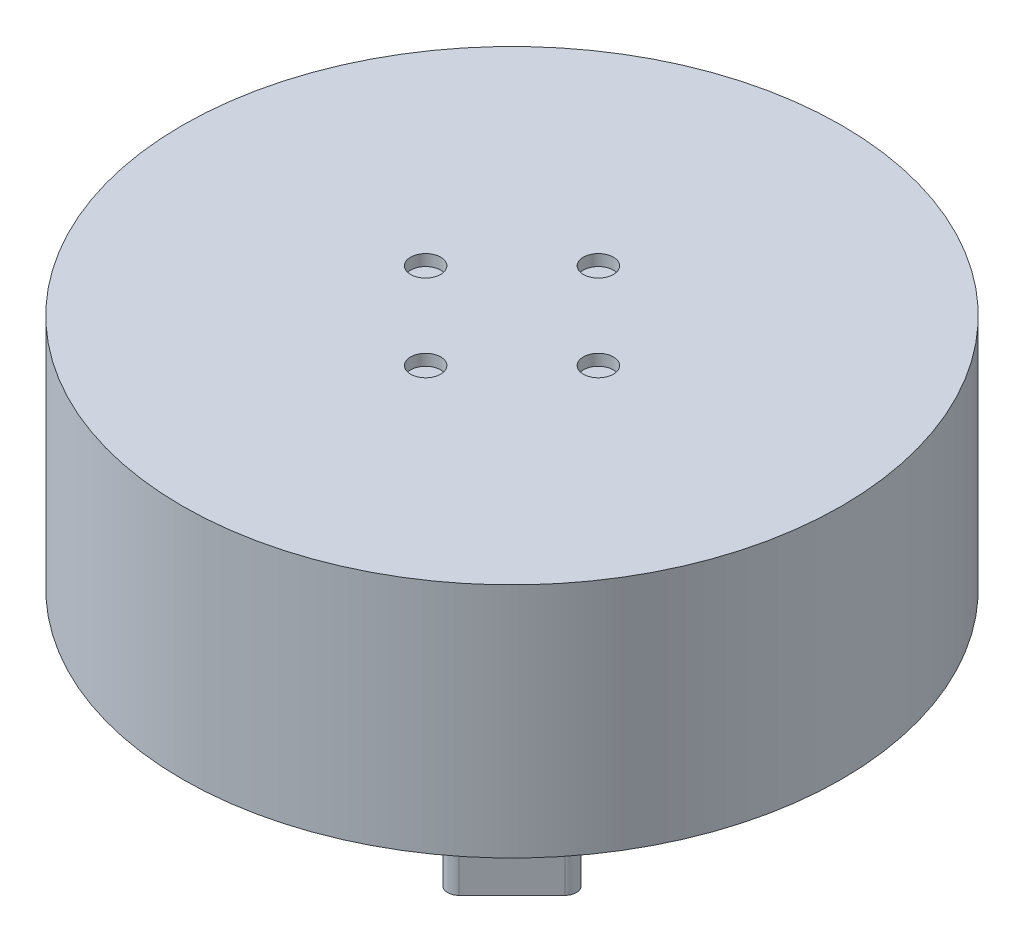
ISO-10303-21;
HEADER;
FILE_DESCRIPTION(('STEP AP214'),'2;1');
FILE_NAME('part.step','',(''),(''),'','','');
FILE_SCHEMA(('AUTOMOTIVE_DESIGN { 1 0 10303 214 1 1 1 1 }'));
ENDSEC;
DATA;
#1=APPLICATION_CONTEXT('core data for automotive mechanical design processes');
#2=APPLICATION_PROTOCOL_DEFINITION('international standard','automotive_design',2000,#1);
#3=PRODUCT_CONTEXT('',#1,'mechanical');
#4=PRODUCT('Part','Part','',(#3));
#5=PRODUCT_RELATED_PRODUCT_CATEGORY('part','',(#4));
#6=PRODUCT_DEFINITION_FORMATION('','',#4);
#7=PRODUCT_DEFINITION_CONTEXT('part definition',#1,'design');
#8=PRODUCT_DEFINITION('design','',#6,#7);
#9=PRODUCT_DEFINITION_SHAPE('','',#8);
#10=(LENGTH_UNIT() NAMED_UNIT(*) SI_UNIT(.MILLI.,.METRE.));
#11=(NAMED_UNIT(*) PLANE_ANGLE_UNIT() SI_UNIT($,.RADIAN.));
#12=(NAMED_UNIT(*) SI_UNIT($,.STERADIAN.) SOLID_ANGLE_UNIT());
#13=UNCERTAINTY_MEASURE_WITH_UNIT(LENGTH_MEASURE(1.E-05),#10,'distance_accuracy_value','');
#14=(GEOMETRIC_REPRESENTATION_CONTEXT(3) GLOBAL_UNCERTAINTY_ASSIGNED_CONTEXT((#13)) GLOBAL_UNIT_ASSIGNED_CONTEXT((#10,
#11,#12)) REPRESENTATION_CONTEXT('',''));
#15=CARTESIAN_POINT('',(0.,0.,0.));
#16=DIRECTION('',(0.,0.,1.));
#17=DIRECTION('',(1.,0.,0.));
#18=AXIS2_PLACEMENT_3D('',#15,#16,#17);
#19=CARTESIAN_POINT('',(0.,0.,0.));
#20=DIRECTION('',(0.,1.,0.));
#21=DIRECTION('',(0.,0.,1.));
#22=AXIS2_PLACEMENT_3D('',#19,#20,#21);
#23=PLANE('',#22);
#24=CARTESIAN_POINT('',(0.,0.,0.));
#25=DIRECTION('',(0.,1.,0.));
#26=DIRECTION('',(0.,0.,1.));
#27=AXIS2_PLACEMENT_3D('',#24,#25,#26);
#28=CIRCLE('',#27,43.9);
#29=CARTESIAN_POINT('',(0.,0.,43.9));
#30=VERTEX_POINT('',#29);
#31=EDGE_CURVE('E43',#30,#30,#28,.T.);
#32=ORIENTED_EDGE('',*,*,#31,.F.);
#33=EDGE_LOOP('',(#32));
#34=FACE_BOUND('',#33,.T.);
#35=CARTESIAN_POINT('',(-18.,0.,0.));
#36=DIRECTION('',(0.,-1.,0.));
#37=DIRECTION('',(0.,0.,-1.));
#38=AXIS2_PLACEMENT_3D('',#35,#36,#37);
#39=CIRCLE('',#38,2.);
#40=CARTESIAN_POINT('',(-18.,0.,-2.));
#41=VERTEX_POINT('',#40);
#42=EDGE_CURVE('E104',#41,#41,#39,.T.);
#43=ORIENTED_EDGE('',*,*,#42,.F.);
#44=EDGE_LOOP('',(#43));
#45=FACE_BOUND('',#44,.T.);
#46=CARTESIAN_POINT('',(0.,0.,-18.));
#47=DIRECTION('',(0.,-1.,0.));
#48=DIRECTION('',(0.,0.,-1.));
#49=AXIS2_PLACEMENT_3D('',#46,#47,#48);
#50=CIRCLE('',#49,2.);
#51=CARTESIAN_POINT('',(0.,0.,-20.));
#52=VERTEX_POINT('',#51);
#53=EDGE_CURVE('E122',#52,#52,#50,.T.);
#54=ORIENTED_EDGE('',*,*,#53,.F.);
#55=EDGE_LOOP('',(#54));
#56=FACE_BOUND('',#55,.T.);
#57=CARTESIAN_POINT('',(18.,0.,0.));
#58=DIRECTION('',(0.,-1.,0.));
#59=DIRECTION('',(0.,0.,-1.));
#60=AXIS2_PLACEMENT_3D('',#57,#58,#59);
#61=CIRCLE('',#60,2.);
#62=CARTESIAN_POINT('',(18.,0.,-2.));
#63=VERTEX_POINT('',#62);
#64=EDGE_CURVE('E116',#63,#63,#61,.T.);
#65=ORIENTED_EDGE('',*,*,#64,.F.);
#66=EDGE_LOOP('',(#65));
#67=FACE_BOUND('',#66,.T.);
#68=CARTESIAN_POINT('',(0.,0.,18.));
#69=DIRECTION('',(0.,-1.,0.));
#70=DIRECTION('',(0.,0.,-1.));
#71=AXIS2_PLACEMENT_3D('',#68,#69,#70);
#72=CIRCLE('',#71,2.);
#73=CARTESIAN_POINT('',(0.,0.,16.));
#74=VERTEX_POINT('',#73);
#75=EDGE_CURVE('E113',#74,#74,#72,.T.);
#76=ORIENTED_EDGE('',*,*,#75,.F.);
#77=EDGE_LOOP('',(#76));
#78=FACE_BOUND('',#77,.T.);
#79=CARTESIAN_POINT('',(24.7487373415292,0.,31.8198051533946));
#80=DIRECTION('',(0.,-1.,0.));
#81=DIRECTION('',(0.,0.,-1.));
#82=AXIS2_PLACEMENT_3D('',#79,#80,#81);
#83=CIRCLE('',#82,1.5);
#84=CARTESIAN_POINT('',(25.809397513309,0.,32.8804653251745));
#85=VERTEX_POINT('',#84);
#86=CARTESIAN_POINT('',(23.6880771697493,0.,30.7591449816148));
#87=VERTEX_POINT('',#86);
#88=EDGE_CURVE('E100',#85,#87,#83,.T.);
#89=ORIENTED_EDGE('',*,*,#88,.F.);
#90=DIRECTION('',(-0.707106781186548,0.,0.707106781186547));
#91=VECTOR('',#90,1.);
#92=CARTESIAN_POINT('',(25.809397513309,0.,32.8804653251745));
#93=LINE('',#92,#91);
#94=CARTESIAN_POINT('',(32.8804653251744,0.,25.809397513309));
#95=VERTEX_POINT('',#94);
#96=EDGE_CURVE('E97',#95,#85,#93,.T.);
#97=ORIENTED_EDGE('',*,*,#96,.F.);
#98=CARTESIAN_POINT('',(31.8198051533946,0.,24.7487373415292));
#99=DIRECTION('',(0.,-1.,0.));
#100=DIRECTION('',(0.,0.,-1.));
#101=AXIS2_PLACEMENT_3D('',#98,#99,#100);
#102=CIRCLE('',#101,1.5);
#103=CARTESIAN_POINT('',(30.7591449816148,0.,23.6880771697494));
#104=VERTEX_POINT('',#103);
#105=EDGE_CURVE('E59',#104,#95,#102,.T.);
#106=ORIENTED_EDGE('',*,*,#105,.F.);
#107=DIRECTION('',(0.707106781186548,0.,-0.707106781186547));
#108=VECTOR('',#107,1.);
#109=CARTESIAN_POINT('',(23.6880771697493,0.,30.7591449816148));
#110=LINE('',#109,#108);
#111=EDGE_CURVE('E54',#87,#104,#110,.T.);
#112=ORIENTED_EDGE('',*,*,#111,.F.);
#113=EDGE_LOOP('',(#89,#97,#106,#112));
#114=FACE_BOUND('',#113,.T.);
#115=ADVANCED_FACE('F39',(#34,#45,#56,#67,#78,#114),#23,.F.);
#116=CARTESIAN_POINT('',(0.,31.5,0.));
#117=DIRECTION('',(0.,-1.,0.));
#118=DIRECTION('',(0.,0.,-1.));
#119=AXIS2_PLACEMENT_3D('',#116,#117,#118);
#120=CYLINDRICAL_SURFACE('',#119,43.9);
#121=CARTESIAN_POINT('',(0.,31.5,0.));
#122=DIRECTION('',(0.,1.,0.));
#123=DIRECTION('',(0.,0.,1.));
#124=AXIS2_PLACEMENT_3D('',#121,#122,#123);
#125=CIRCLE('',#124,43.9);
#126=CARTESIAN_POINT('',(0.,31.5,43.9));
#127=VERTEX_POINT('',#126);
#128=EDGE_CURVE('E11',#127,#127,#125,.T.);
#129=ORIENTED_EDGE('',*,*,#128,.F.);
#130=EDGE_LOOP('',(#129));
#131=FACE_BOUND('',#130,.T.);
#132=ORIENTED_EDGE('',*,*,#31,.T.);
#133=EDGE_LOOP('',(#132));
#134=FACE_BOUND('',#133,.T.);
#135=ADVANCED_FACE('F41',(#131,#134),#120,.T.);
#136=CARTESIAN_POINT('',(0.,31.5,0.));
#137=DIRECTION('',(0.,1.,0.));
#138=DIRECTION('',(0.,0.,1.));
#139=AXIS2_PLACEMENT_3D('',#136,#137,#138);
#140=PLANE('',#139);
#141=CARTESIAN_POINT('',(0.,31.5,-11.5));
#142=DIRECTION('',(0.,1.,0.));
#143=DIRECTION('',(0.,0.,1.));
#144=AXIS2_PLACEMENT_3D('',#141,#142,#143);
#145=CIRCLE('',#144,2.);
#146=CARTESIAN_POINT('',(0.,31.5,-9.5));
#147=VERTEX_POINT('',#146);
#148=EDGE_CURVE('E174',#147,#147,#145,.T.);
#149=ORIENTED_EDGE('',*,*,#148,.F.);
#150=EDGE_LOOP('',(#149));
#151=FACE_BOUND('',#150,.T.);
#152=CARTESIAN_POINT('',(11.5,31.5,0.));
#153=DIRECTION('',(0.,1.,0.));
#154=DIRECTION('',(0.,0.,1.));
#155=AXIS2_PLACEMENT_3D('',#152,#153,#154);
#156=CIRCLE('',#155,2.);
#157=CARTESIAN_POINT('',(11.5,31.5,2.));
#158=VERTEX_POINT('',#157);
#159=EDGE_CURVE('E171',#158,#158,#156,.T.);
#160=ORIENTED_EDGE('',*,*,#159,.F.);
#161=EDGE_LOOP('',(#160));
#162=FACE_BOUND('',#161,.T.);
#163=CARTESIAN_POINT('',(0.,31.5,11.5));
#164=DIRECTION('',(0.,1.,0.));
#165=DIRECTION('',(0.,0.,1.));
#166=AXIS2_PLACEMENT_3D('',#163,#164,#165);
#167=CIRCLE('',#166,2.);
#168=CARTESIAN_POINT('',(0.,31.5,13.5));
#169=VERTEX_POINT('',#168);
#170=EDGE_CURVE('E165',#169,#169,#167,.T.);
#171=ORIENTED_EDGE('',*,*,#170,.F.);
#172=EDGE_LOOP('',(#171));
#173=FACE_BOUND('',#172,.T.);
#174=CARTESIAN_POINT('',(-11.5,31.5,0.));
#175=DIRECTION('',(0.,1.,0.));
#176=DIRECTION('',(0.,0.,1.));
#177=AXIS2_PLACEMENT_3D('',#174,#175,#176);
#178=CIRCLE('',#177,2.);
#179=CARTESIAN_POINT('',(-11.5,31.5,2.));
#180=VERTEX_POINT('',#179);
#181=EDGE_CURVE('E159',#180,#180,#178,.T.);
#182=ORIENTED_EDGE('',*,*,#181,.F.);
#183=EDGE_LOOP('',(#182));
#184=FACE_BOUND('',#183,.T.);
#185=ORIENTED_EDGE('',*,*,#128,.T.);
#186=EDGE_LOOP('',(#185));
#187=FACE_BOUND('',#186,.T.);
#188=ADVANCED_FACE('F189',(#151,#162,#173,#184,#187),#140,.T.);
#189=CARTESIAN_POINT('',(-18.,1.5,0.));
#190=DIRECTION('',(0.,-1.,0.));
#191=DIRECTION('',(0.,0.,-1.));
#192=AXIS2_PLACEMENT_3D('',#189,#190,#191);
#193=CYLINDRICAL_SURFACE('',#192,2.);
#194=CARTESIAN_POINT('',(-18.,1.5,0.));
#195=DIRECTION('',(0.,-1.,0.));
#196=DIRECTION('',(0.,0.,-1.));
#197=AXIS2_PLACEMENT_3D('',#194,#195,#196);
#198=CIRCLE('',#197,2.);
#199=CARTESIAN_POINT('',(-18.,1.5,-2.));
#200=VERTEX_POINT('',#199);
#201=EDGE_CURVE('E101',#200,#200,#198,.T.);
#202=ORIENTED_EDGE('',*,*,#201,.F.);
#203=EDGE_LOOP('',(#202));
#204=FACE_BOUND('',#203,.T.);
#205=ORIENTED_EDGE('',*,*,#42,.T.);
#206=EDGE_LOOP('',(#205));
#207=FACE_BOUND('',#206,.T.);
#208=ADVANCED_FACE('F131',(#204,#207),#193,.F.);
#209=CARTESIAN_POINT('',(-18.,1.5,0.));
#210=DIRECTION('',(0.,-1.,0.));
#211=DIRECTION('',(0.,0.,-1.));
#212=AXIS2_PLACEMENT_3D('',#209,#210,#211);
#213=PLANE('',#212);
#214=ORIENTED_EDGE('',*,*,#201,.T.);
#215=EDGE_LOOP('',(#214));
#216=FACE_BOUND('',#215,.T.);
#217=ADVANCED_FACE('F215',(#216),#213,.T.);
#218=CARTESIAN_POINT('',(0.,1.5,-18.));
#219=DIRECTION('',(0.,-1.,0.));
#220=DIRECTION('',(0.,0.,-1.));
#221=AXIS2_PLACEMENT_3D('',#218,#219,#220);
#222=CYLINDRICAL_SURFACE('',#221,2.);
#223=CARTESIAN_POINT('',(0.,1.5,-18.));
#224=DIRECTION('',(0.,-1.,0.));
#225=DIRECTION('',(0.,0.,-1.));
#226=AXIS2_PLACEMENT_3D('',#223,#224,#225);
#227=CIRCLE('',#226,2.);
#228=CARTESIAN_POINT('',(0.,1.5,-20.));
#229=VERTEX_POINT('',#228);
#230=EDGE_CURVE('E125',#229,#229,#227,.T.);
#231=ORIENTED_EDGE('',*,*,#230,.F.);
#232=EDGE_LOOP('',(#231));
#233=FACE_BOUND('',#232,.T.);
#234=ORIENTED_EDGE('',*,*,#53,.T.);
#235=EDGE_LOOP('',(#234));
#236=FACE_BOUND('',#235,.T.);
#237=ADVANCED_FACE('F224',(#233,#236),#222,.F.);
#238=CARTESIAN_POINT('',(0.,1.5,-18.));
#239=DIRECTION('',(0.,-1.,0.));
#240=DIRECTION('',(0.,0.,-1.));
#241=AXIS2_PLACEMENT_3D('',#238,#239,#240);
#242=PLANE('',#241);
#243=ORIENTED_EDGE('',*,*,#230,.T.);
#244=EDGE_LOOP('',(#243));
#245=FACE_BOUND('',#244,.T.);
#246=ADVANCED_FACE('F233',(#245),#242,.T.);
#247=CARTESIAN_POINT('',(18.,1.5,0.));
#248=DIRECTION('',(0.,-1.,0.));
#249=DIRECTION('',(0.,0.,-1.));
#250=AXIS2_PLACEMENT_3D('',#247,#248,#249);
#251=CYLINDRICAL_SURFACE('',#250,2.);
#252=CARTESIAN_POINT('',(18.,1.5,0.));
#253=DIRECTION('',(0.,-1.,0.));
#254=DIRECTION('',(0.,0.,-1.));
#255=AXIS2_PLACEMENT_3D('',#252,#253,#254);
#256=CIRCLE('',#255,2.);
#257=CARTESIAN_POINT('',(18.,1.5,-2.));
#258=VERTEX_POINT('',#257);
#259=EDGE_CURVE('E119',#258,#258,#256,.T.);
#260=ORIENTED_EDGE('',*,*,#259,.F.);
#261=EDGE_LOOP('',(#260));
#262=FACE_BOUND('',#261,.T.);
#263=ORIENTED_EDGE('',*,*,#64,.T.);
#264=EDGE_LOOP('',(#263));
#265=FACE_BOUND('',#264,.T.);
#266=ADVANCED_FACE('F242',(#262,#265),#251,.F.);
#267=CARTESIAN_POINT('',(18.,1.5,0.));
#268=DIRECTION('',(0.,-1.,0.));
#269=DIRECTION('',(0.,0.,-1.));
#270=AXIS2_PLACEMENT_3D('',#267,#268,#269);
#271=PLANE('',#270);
#272=ORIENTED_EDGE('',*,*,#259,.T.);
#273=EDGE_LOOP('',(#272));
#274=FACE_BOUND('',#273,.T.);
#275=ADVANCED_FACE('F251',(#274),#271,.T.);
#276=CARTESIAN_POINT('',(0.,1.5,18.));
#277=DIRECTION('',(0.,-1.,0.));
#278=DIRECTION('',(0.,0.,-1.));
#279=AXIS2_PLACEMENT_3D('',#276,#277,#278);
#280=CYLINDRICAL_SURFACE('',#279,2.);
#281=CARTESIAN_POINT('',(0.,1.5,18.));
#282=DIRECTION('',(0.,-1.,0.));
#283=DIRECTION('',(0.,0.,-1.));
#284=AXIS2_PLACEMENT_3D('',#281,#282,#283);
#285=CIRCLE('',#284,2.);
#286=CARTESIAN_POINT('',(0.,1.5,16.));
#287=VERTEX_POINT('',#286);
#288=EDGE_CURVE('E110',#287,#287,#285,.T.);
#289=ORIENTED_EDGE('',*,*,#288,.F.);
#290=EDGE_LOOP('',(#289));
#291=FACE_BOUND('',#290,.T.);
#292=ORIENTED_EDGE('',*,*,#75,.T.);
#293=EDGE_LOOP('',(#292));
#294=FACE_BOUND('',#293,.T.);
#295=ADVANCED_FACE('F260',(#291,#294),#280,.F.);
#296=CARTESIAN_POINT('',(0.,1.5,18.));
#297=DIRECTION('',(0.,-1.,0.));
#298=DIRECTION('',(0.,0.,-1.));
#299=AXIS2_PLACEMENT_3D('',#296,#297,#298);
#300=PLANE('',#299);
#301=ORIENTED_EDGE('',*,*,#288,.T.);
#302=EDGE_LOOP('',(#301));
#303=FACE_BOUND('',#302,.T.);
#304=ADVANCED_FACE('F269',(#303),#300,.T.);
#305=CARTESIAN_POINT('',(24.7487373415292,-6.,31.8198051533946));
#306=DIRECTION('',(0.,1.,0.));
#307=DIRECTION('',(0.,0.,1.));
#308=AXIS2_PLACEMENT_3D('',#305,#306,#307);
#309=CYLINDRICAL_SURFACE('',#308,1.5);
#310=ORIENTED_EDGE('',*,*,#88,.T.);
#311=DIRECTION('',(0.,1.,0.));
#312=VECTOR('',#311,1.);
#313=CARTESIAN_POINT('',(23.6880771697493,-6.,30.7591449816148));
#314=LINE('',#313,#312);
#315=CARTESIAN_POINT('',(23.6880771697493,-6.,30.7591449816148));
#316=VERTEX_POINT('',#315);
#317=EDGE_CURVE('E81',#316,#87,#314,.T.);
#318=ORIENTED_EDGE('',*,*,#317,.F.);
#319=CARTESIAN_POINT('',(24.7487373415292,-6.,31.8198051533946));
#320=DIRECTION('',(0.,-1.,0.));
#321=DIRECTION('',(0.,0.,-1.));
#322=AXIS2_PLACEMENT_3D('',#319,#320,#321);
#323=CIRCLE('',#322,1.5);
#324=CARTESIAN_POINT('',(25.809397513309,-6.,32.8804653251745));
#325=VERTEX_POINT('',#324);
#326=EDGE_CURVE('E88',#325,#316,#323,.T.);
#327=ORIENTED_EDGE('',*,*,#326,.F.);
#328=DIRECTION('',(0.,1.,0.));
#329=VECTOR('',#328,1.);
#330=CARTESIAN_POINT('',(25.809397513309,-6.,32.8804653251745));
#331=LINE('',#330,#329);
#332=EDGE_CURVE('E147',#325,#85,#331,.T.);
#333=ORIENTED_EDGE('',*,*,#332,.T.);
#334=EDGE_LOOP('',(#310,#318,#327,#333));
#335=FACE_BOUND('',#334,.T.);
#336=ADVANCED_FACE('F99',(#335),#309,.T.);
#337=CARTESIAN_POINT('',(23.6880771697493,-6.,30.7591449816148));
#338=DIRECTION('',(0.707106781186547,0.,0.707106781186548));
#339=DIRECTION('',(0.707106781186548,0.,-0.707106781186547));
#340=AXIS2_PLACEMENT_3D('',#337,#338,#339);
#341=PLANE('',#340);
#342=ORIENTED_EDGE('',*,*,#111,.T.);
#343=DIRECTION('',(0.,1.,0.));
#344=VECTOR('',#343,1.);
#345=CARTESIAN_POINT('',(30.7591449816148,-6.,23.6880771697494));
#346=LINE('',#345,#344);
#347=CARTESIAN_POINT('',(30.7591449816148,-6.,23.6880771697494));
#348=VERTEX_POINT('',#347);
#349=EDGE_CURVE('E84',#348,#104,#346,.T.);
#350=ORIENTED_EDGE('',*,*,#349,.F.);
#351=DIRECTION('',(0.707106781186548,0.,-0.707106781186547));
#352=VECTOR('',#351,1.);
#353=CARTESIAN_POINT('',(23.6880771697493,-6.,30.7591449816148));
#354=LINE('',#353,#352);
#355=EDGE_CURVE('E77',#316,#348,#354,.T.);
#356=ORIENTED_EDGE('',*,*,#355,.F.);
#357=ORIENTED_EDGE('',*,*,#317,.T.);
#358=EDGE_LOOP('',(#342,#350,#356,#357));
#359=FACE_BOUND('',#358,.T.);
#360=ADVANCED_FACE('F79',(#359),#341,.F.);
#361=CARTESIAN_POINT('',(31.8198051533946,-6.,24.7487373415292));
#362=DIRECTION('',(0.,1.,0.));
#363=DIRECTION('',(0.,0.,1.));
#364=AXIS2_PLACEMENT_3D('',#361,#362,#363);
#365=CYLINDRICAL_SURFACE('',#364,1.5);
#366=ORIENTED_EDGE('',*,*,#105,.T.);
#367=DIRECTION('',(0.,1.,0.));
#368=VECTOR('',#367,1.);
#369=CARTESIAN_POINT('',(32.8804653251745,-6.,25.809397513309));
#370=LINE('',#369,#368);
#371=CARTESIAN_POINT('',(32.8804653251745,-6.,25.809397513309));
#372=VERTEX_POINT('',#371);
#373=EDGE_CURVE('E106',#372,#95,#370,.T.);
#374=ORIENTED_EDGE('',*,*,#373,.F.);
#375=CARTESIAN_POINT('',(31.8198051533946,-6.,24.7487373415292));
#376=DIRECTION('',(0.,-1.,0.));
#377=DIRECTION('',(0.,0.,-1.));
#378=AXIS2_PLACEMENT_3D('',#375,#376,#377);
#379=CIRCLE('',#378,1.5);
#380=EDGE_CURVE('E87',#348,#372,#379,.T.);
#381=ORIENTED_EDGE('',*,*,#380,.F.);
#382=ORIENTED_EDGE('',*,*,#349,.T.);
#383=EDGE_LOOP('',(#366,#374,#381,#382));
#384=FACE_BOUND('',#383,.T.);
#385=ADVANCED_FACE('F297',(#384),#365,.T.);
#386=CARTESIAN_POINT('',(25.809397513309,-6.,32.8804653251745));
#387=DIRECTION('',(-0.707106781186547,0.,-0.707106781186548));
#388=DIRECTION('',(-0.707106781186548,0.,0.707106781186547));
#389=AXIS2_PLACEMENT_3D('',#386,#387,#388);
#390=PLANE('',#389);
#391=ORIENTED_EDGE('',*,*,#96,.T.);
#392=ORIENTED_EDGE('',*,*,#332,.F.);
#393=DIRECTION('',(-0.707106781186548,0.,0.707106781186547));
#394=VECTOR('',#393,1.);
#395=CARTESIAN_POINT('',(25.809397513309,-6.,32.8804653251745));
#396=LINE('',#395,#394);
#397=EDGE_CURVE('E93',#372,#325,#396,.T.);
#398=ORIENTED_EDGE('',*,*,#397,.F.);
#399=ORIENTED_EDGE('',*,*,#373,.T.);
#400=EDGE_LOOP('',(#391,#392,#398,#399));
#401=FACE_BOUND('',#400,.T.);
#402=ADVANCED_FACE('F146',(#401),#390,.F.);
#403=CARTESIAN_POINT('',(24.7487373415292,-6.,31.8198051533946));
#404=DIRECTION('',(0.,-1.,0.));
#405=DIRECTION('',(0.,0.,-1.));
#406=AXIS2_PLACEMENT_3D('',#403,#404,#405);
#407=PLANE('',#406);
#408=ORIENTED_EDGE('',*,*,#326,.T.);
#409=ORIENTED_EDGE('',*,*,#355,.T.);
#410=ORIENTED_EDGE('',*,*,#380,.T.);
#411=ORIENTED_EDGE('',*,*,#397,.T.);
#412=EDGE_LOOP('',(#408,#409,#410,#411));
#413=FACE_BOUND('',#412,.T.);
#414=ADVANCED_FACE('F91',(#413),#407,.T.);
#415=CARTESIAN_POINT('',(-11.5,30.,0.));
#416=DIRECTION('',(0.,1.,0.));
#417=DIRECTION('',(0.,0.,1.));
#418=AXIS2_PLACEMENT_3D('',#415,#416,#417);
#419=CYLINDRICAL_SURFACE('',#418,2.);
#420=CARTESIAN_POINT('',(-11.5,30.,0.));
#421=DIRECTION('',(0.,1.,0.));
#422=DIRECTION('',(0.,0.,1.));
#423=AXIS2_PLACEMENT_3D('',#420,#421,#422);
#424=CIRCLE('',#423,2.);
#425=CARTESIAN_POINT('',(-11.5,30.,2.));
#426=VERTEX_POINT('',#425);
#427=EDGE_CURVE('E156',#426,#426,#424,.T.);
#428=ORIENTED_EDGE('',*,*,#427,.F.);
#429=EDGE_LOOP('',(#428));
#430=FACE_BOUND('',#429,.T.);
#431=ORIENTED_EDGE('',*,*,#181,.T.);
#432=EDGE_LOOP('',(#431));
#433=FACE_BOUND('',#432,.T.);
#434=ADVANCED_FACE('F319',(#430,#433),#419,.F.);
#435=CARTESIAN_POINT('',(-11.5,30.,0.));
#436=DIRECTION('',(0.,1.,0.));
#437=DIRECTION('',(0.,0.,1.));
#438=AXIS2_PLACEMENT_3D('',#435,#436,#437);
#439=PLANE('',#438);
#440=ORIENTED_EDGE('',*,*,#427,.T.);
#441=EDGE_LOOP('',(#440));
#442=FACE_BOUND('',#441,.T.);
#443=ADVANCED_FACE('F332',(#442),#439,.T.);
#444=CARTESIAN_POINT('',(0.,30.,11.5));
#445=DIRECTION('',(0.,1.,0.));
#446=DIRECTION('',(0.,0.,1.));
#447=AXIS2_PLACEMENT_3D('',#444,#445,#446);
#448=CYLINDRICAL_SURFACE('',#447,2.);
#449=CARTESIAN_POINT('',(0.,30.,11.5));
#450=DIRECTION('',(0.,1.,0.));
#451=DIRECTION('',(0.,0.,1.));
#452=AXIS2_PLACEMENT_3D('',#449,#450,#451);
#453=CIRCLE('',#452,2.);
#454=CARTESIAN_POINT('',(0.,30.,13.5));
#455=VERTEX_POINT('',#454);
#456=EDGE_CURVE('E162',#455,#455,#453,.T.);
#457=ORIENTED_EDGE('',*,*,#456,.F.);
#458=EDGE_LOOP('',(#457));
#459=FACE_BOUND('',#458,.T.);
#460=ORIENTED_EDGE('',*,*,#170,.T.);
#461=EDGE_LOOP('',(#460));
#462=FACE_BOUND('',#461,.T.);
#463=ADVANCED_FACE('F341',(#459,#462),#448,.F.);
#464=CARTESIAN_POINT('',(0.,30.,11.5));
#465=DIRECTION('',(0.,1.,0.));
#466=DIRECTION('',(0.,0.,1.));
#467=AXIS2_PLACEMENT_3D('',#464,#465,#466);
#468=PLANE('',#467);
#469=ORIENTED_EDGE('',*,*,#456,.T.);
#470=EDGE_LOOP('',(#469));
#471=FACE_BOUND('',#470,.T.);
#472=ADVANCED_FACE('F350',(#471),#468,.T.);
#473=CARTESIAN_POINT('',(11.5,30.,0.));
#474=DIRECTION('',(0.,1.,0.));
#475=DIRECTION('',(0.,0.,1.));
#476=AXIS2_PLACEMENT_3D('',#473,#474,#475);
#477=CYLINDRICAL_SURFACE('',#476,2.);
#478=CARTESIAN_POINT('',(11.5,30.,0.));
#479=DIRECTION('',(0.,1.,0.));
#480=DIRECTION('',(0.,0.,1.));
#481=AXIS2_PLACEMENT_3D('',#478,#479,#480);
#482=CIRCLE('',#481,2.);
#483=CARTESIAN_POINT('',(11.5,30.,2.));
#484=VERTEX_POINT('',#483);
#485=EDGE_CURVE('E168',#484,#484,#482,.T.);
#486=ORIENTED_EDGE('',*,*,#485,.F.);
#487=EDGE_LOOP('',(#486));
#488=FACE_BOUND('',#487,.T.);
#489=ORIENTED_EDGE('',*,*,#159,.T.);
#490=EDGE_LOOP('',(#489));
#491=FACE_BOUND('',#490,.T.);
#492=ADVANCED_FACE('F359',(#488,#491),#477,.F.);
#493=CARTESIAN_POINT('',(11.5,30.,0.));
#494=DIRECTION('',(0.,1.,0.));
#495=DIRECTION('',(0.,0.,1.));
#496=AXIS2_PLACEMENT_3D('',#493,#494,#495);
#497=PLANE('',#496);
#498=ORIENTED_EDGE('',*,*,#485,.T.);
#499=EDGE_LOOP('',(#498));
#500=FACE_BOUND('',#499,.T.);
#501=ADVANCED_FACE('F185',(#500),#497,.T.);
#502=CARTESIAN_POINT('',(0.,30.,-11.5));
#503=DIRECTION('',(0.,1.,0.));
#504=DIRECTION('',(0.,0.,1.));
#505=AXIS2_PLACEMENT_3D('',#502,#503,#504);
#506=CYLINDRICAL_SURFACE('',#505,2.);
#507=CARTESIAN_POINT('',(0.,30.,-11.5));
#508=DIRECTION('',(0.,1.,0.));
#509=DIRECTION('',(0.,0.,1.));
#510=AXIS2_PLACEMENT_3D('',#507,#508,#509);
#511=CIRCLE('',#510,2.);
#512=CARTESIAN_POINT('',(0.,30.,-9.5));
#513=VERTEX_POINT('',#512);
#514=EDGE_CURVE('E142',#513,#513,#511,.T.);
#515=ORIENTED_EDGE('',*,*,#514,.F.);
#516=EDGE_LOOP('',(#515));
#517=FACE_BOUND('',#516,.T.);
#518=ORIENTED_EDGE('',*,*,#148,.T.);
#519=EDGE_LOOP('',(#518));
#520=FACE_BOUND('',#519,.T.);
#521=ADVANCED_FACE('F182',(#517,#520),#506,.F.);
#522=CARTESIAN_POINT('',(0.,30.,-11.5));
#523=DIRECTION('',(0.,1.,0.));
#524=DIRECTION('',(0.,0.,1.));
#525=AXIS2_PLACEMENT_3D('',#522,#523,#524);
#526=PLANE('',#525);
#527=ORIENTED_EDGE('',*,*,#514,.T.);
#528=EDGE_LOOP('',(#527));
#529=FACE_BOUND('',#528,.T.);
#530=ADVANCED_FACE('F180',(#529),#526,.T.);
#531=CLOSED_SHELL('',(#115,#135,#188,#208,#217,#237,#246,#266,#275,#295,#304,#336,#360,#385,
#402,#414,#434,#443,#463,#472,#492,#501,#521,#530));
#532=MANIFOLD_SOLID_BREP('B2',#531);
#533=ADVANCED_BREP_SHAPE_REPRESENTATION('',(#18,#532),#14);
#534=SHAPE_DEFINITION_REPRESENTATION(#9,#533);
ENDSEC;
END-ISO-10303-21;
